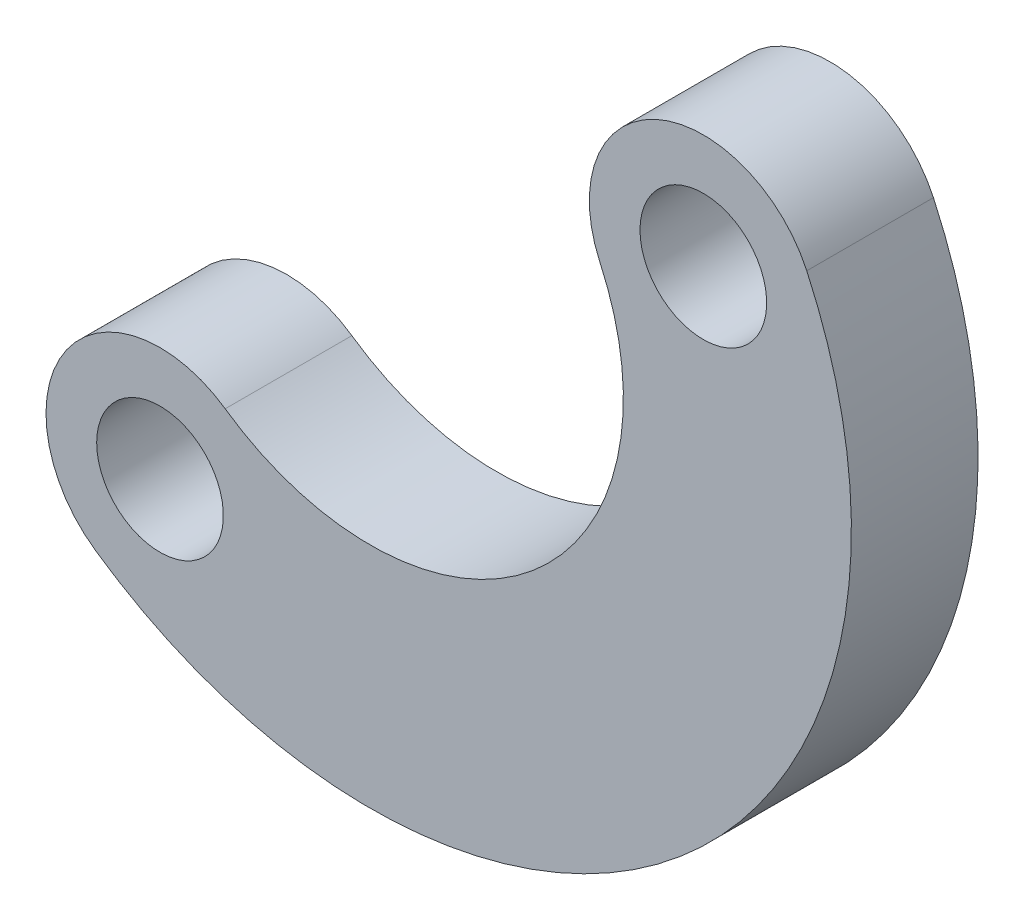
ISO-10303-21;
HEADER;
FILE_DESCRIPTION(('STEP AP214'),'2;1');
FILE_NAME('part.step','',(''),(''),'','','');
FILE_SCHEMA(('AUTOMOTIVE_DESIGN { 1 0 10303 214 1 1 1 1 }'));
ENDSEC;
DATA;
#1=APPLICATION_CONTEXT('core data for automotive mechanical design processes');
#2=APPLICATION_PROTOCOL_DEFINITION('international standard','automotive_design',2000,#1);
#3=PRODUCT_CONTEXT('',#1,'mechanical');
#4=PRODUCT('Part','Part','',(#3));
#5=PRODUCT_RELATED_PRODUCT_CATEGORY('part','',(#4));
#6=PRODUCT_DEFINITION_FORMATION('','',#4);
#7=PRODUCT_DEFINITION_CONTEXT('part definition',#1,'design');
#8=PRODUCT_DEFINITION('design','',#6,#7);
#9=PRODUCT_DEFINITION_SHAPE('','',#8);
#10=(LENGTH_UNIT() NAMED_UNIT(*) SI_UNIT(.MILLI.,.METRE.));
#11=(NAMED_UNIT(*) PLANE_ANGLE_UNIT() SI_UNIT($,.RADIAN.));
#12=(NAMED_UNIT(*) SI_UNIT($,.STERADIAN.) SOLID_ANGLE_UNIT());
#13=UNCERTAINTY_MEASURE_WITH_UNIT(LENGTH_MEASURE(1.E-05),#10,'distance_accuracy_value','');
#14=(GEOMETRIC_REPRESENTATION_CONTEXT(3) GLOBAL_UNCERTAINTY_ASSIGNED_CONTEXT((#13)) GLOBAL_UNIT_ASSIGNED_CONTEXT((#10,
#11,#12)) REPRESENTATION_CONTEXT('',''));
#15=CARTESIAN_POINT('',(0.,0.,0.));
#16=DIRECTION('',(0.,0.,1.));
#17=DIRECTION('',(1.,0.,0.));
#18=AXIS2_PLACEMENT_3D('',#15,#16,#17);
#19=CARTESIAN_POINT('',(-19.5131267924345,28.5690281099331,17.));
#20=DIRECTION('',(0.,0.,1.));
#21=DIRECTION('',(1.,0.,0.));
#22=AXIS2_PLACEMENT_3D('',#19,#20,#21);
#23=PLANE('',#22);
#24=CARTESIAN_POINT('',(-22.,25.,17.));
#25=DIRECTION('',(0.,0.,-1.));
#26=DIRECTION('',(1.,0.,0.));
#27=AXIS2_PLACEMENT_3D('',#24,#25,#26);
#28=CIRCLE('',#27,2.69999999999998);
#29=CARTESIAN_POINT('',(-23.5435764736614,22.784741173145,17.));
#30=VERTEX_POINT('',#29);
#31=CARTESIAN_POINT('',(-20.4564235263386,27.215258826855,17.));
#32=VERTEX_POINT('',#31);
#33=EDGE_CURVE('E87',#30,#32,#28,.T.);
#34=ORIENTED_EDGE('',*,*,#33,.T.);
#35=CARTESIAN_POINT('',(-17.0262535848689,32.1380562198662,17.));
#36=DIRECTION('',(0.,0.,1.));
#37=DIRECTION('',(1.,0.,0.));
#38=AXIS2_PLACEMENT_3D('',#35,#36,#37);
#39=CIRCLE('',#38,6.);
#40=CARTESIAN_POINT('',(-11.5826017862991,34.6612793760551,17.));
#41=VERTEX_POINT('',#40);
#42=EDGE_CURVE('E82',#32,#41,#39,.T.);
#43=ORIENTED_EDGE('',*,*,#42,.T.);
#44=CARTESIAN_POINT('',(-9.13295847694271,35.7967297963401,17.));
#45=DIRECTION('',(0.,0.,-1.));
#46=DIRECTION('',(1.,0.,0.));
#47=AXIS2_PLACEMENT_3D('',#44,#45,#46);
#48=CIRCLE('',#47,2.69999999999999);
#49=CARTESIAN_POINT('',(-6.6833151675863,36.9321802166251,17.));
#50=VERTEX_POINT('',#49);
#51=EDGE_CURVE('E85',#41,#50,#48,.T.);
#52=ORIENTED_EDGE('',*,*,#51,.T.);
#53=CARTESIAN_POINT('',(-17.0262535848689,32.1380562198662,17.));
#54=DIRECTION('',(0.,0.,-1.));
#55=DIRECTION('',(1.,0.,0.));
#56=AXIS2_PLACEMENT_3D('',#53,#54,#55);
#57=CIRCLE('',#56,11.4);
#58=EDGE_CURVE('E52',#50,#30,#57,.T.);
#59=ORIENTED_EDGE('',*,*,#58,.T.);
#60=EDGE_LOOP('',(#34,#43,#52,#59));
#61=FACE_BOUND('',#60,.T.);
#62=CARTESIAN_POINT('',(-9.13295847694271,35.7967297963401,17.));
#63=DIRECTION('',(0.,0.,-1.));
#64=DIRECTION('',(-1.,0.,0.));
#65=AXIS2_PLACEMENT_3D('',#62,#63,#64);
#66=CIRCLE('',#65,1.5);
#67=CARTESIAN_POINT('',(-10.6329584769427,35.7967297963401,17.));
#68=VERTEX_POINT('',#67);
#69=EDGE_CURVE('E102',#68,#68,#66,.T.);
#70=ORIENTED_EDGE('',*,*,#69,.F.);
#71=EDGE_LOOP('',(#70));
#72=FACE_BOUND('',#71,.T.);
#73=CARTESIAN_POINT('',(-22.,25.,17.));
#74=DIRECTION('',(0.,0.,-1.));
#75=DIRECTION('',(-1.,0.,0.));
#76=AXIS2_PLACEMENT_3D('',#73,#74,#75);
#77=CIRCLE('',#76,1.5);
#78=CARTESIAN_POINT('',(-23.5,25.,17.));
#79=VERTEX_POINT('',#78);
#80=EDGE_CURVE('E117',#79,#79,#77,.T.);
#81=ORIENTED_EDGE('',*,*,#80,.F.);
#82=EDGE_LOOP('',(#81));
#83=FACE_BOUND('',#82,.T.);
#84=ADVANCED_FACE('F35',(#61,#72,#83),#23,.F.);
#85=CARTESIAN_POINT('',(-19.5131267924345,28.5690281099331,20.));
#86=DIRECTION('',(0.,0.,1.));
#87=DIRECTION('',(1.,0.,0.));
#88=AXIS2_PLACEMENT_3D('',#85,#86,#87);
#89=PLANE('',#88);
#90=CARTESIAN_POINT('',(-9.13295847694271,35.7967297963401,20.));
#91=DIRECTION('',(0.,0.,-1.));
#92=DIRECTION('',(-1.,0.,0.));
#93=AXIS2_PLACEMENT_3D('',#90,#91,#92);
#94=CIRCLE('',#93,1.5);
#95=CARTESIAN_POINT('',(-10.6329584769427,35.7967297963401,20.));
#96=VERTEX_POINT('',#95);
#97=EDGE_CURVE('E114',#96,#96,#94,.T.);
#98=ORIENTED_EDGE('',*,*,#97,.T.);
#99=EDGE_LOOP('',(#98));
#100=FACE_BOUND('',#99,.T.);
#101=CARTESIAN_POINT('',(-22.,25.,20.));
#102=DIRECTION('',(0.,0.,-1.));
#103=DIRECTION('',(1.,0.,0.));
#104=AXIS2_PLACEMENT_3D('',#101,#102,#103);
#105=CIRCLE('',#104,2.69999999999998);
#106=CARTESIAN_POINT('',(-23.5435764736614,22.784741173145,20.));
#107=VERTEX_POINT('',#106);
#108=CARTESIAN_POINT('',(-20.4564235263386,27.215258826855,20.));
#109=VERTEX_POINT('',#108);
#110=EDGE_CURVE('E99',#107,#109,#105,.T.);
#111=ORIENTED_EDGE('',*,*,#110,.F.);
#112=CARTESIAN_POINT('',(-17.0262535848689,32.1380562198662,20.));
#113=DIRECTION('',(0.,0.,-1.));
#114=DIRECTION('',(1.,0.,0.));
#115=AXIS2_PLACEMENT_3D('',#112,#113,#114);
#116=CIRCLE('',#115,11.4);
#117=CARTESIAN_POINT('',(-6.6833151675863,36.9321802166251,20.));
#118=VERTEX_POINT('',#117);
#119=EDGE_CURVE('E75',#118,#107,#116,.T.);
#120=ORIENTED_EDGE('',*,*,#119,.F.);
#121=CARTESIAN_POINT('',(-9.13295847694271,35.7967297963401,20.));
#122=DIRECTION('',(0.,0.,-1.));
#123=DIRECTION('',(1.,0.,0.));
#124=AXIS2_PLACEMENT_3D('',#121,#122,#123);
#125=CIRCLE('',#124,2.69999999999999);
#126=CARTESIAN_POINT('',(-11.5826017862991,34.6612793760551,20.));
#127=VERTEX_POINT('',#126);
#128=EDGE_CURVE('E69',#127,#118,#125,.T.);
#129=ORIENTED_EDGE('',*,*,#128,.F.);
#130=CARTESIAN_POINT('',(-17.0262535848689,32.1380562198662,20.));
#131=DIRECTION('',(0.,0.,1.));
#132=DIRECTION('',(1.,0.,0.));
#133=AXIS2_PLACEMENT_3D('',#130,#131,#132);
#134=CIRCLE('',#133,6.);
#135=EDGE_CURVE('E91',#109,#127,#134,.T.);
#136=ORIENTED_EDGE('',*,*,#135,.F.);
#137=EDGE_LOOP('',(#111,#120,#129,#136));
#138=FACE_BOUND('',#137,.T.);
#139=CARTESIAN_POINT('',(-22.,25.,20.));
#140=DIRECTION('',(0.,0.,-1.));
#141=DIRECTION('',(-1.,0.,0.));
#142=AXIS2_PLACEMENT_3D('',#139,#140,#141);
#143=CIRCLE('',#142,1.5);
#144=CARTESIAN_POINT('',(-23.5,25.,20.));
#145=VERTEX_POINT('',#144);
#146=EDGE_CURVE('E120',#145,#145,#143,.T.);
#147=ORIENTED_EDGE('',*,*,#146,.T.);
#148=EDGE_LOOP('',(#147));
#149=FACE_BOUND('',#148,.T.);
#150=ADVANCED_FACE('F110',(#100,#138,#149),#89,.T.);
#151=CARTESIAN_POINT('',(-22.,25.,17.));
#152=DIRECTION('',(0.,0.,1.));
#153=DIRECTION('',(1.,0.,0.));
#154=AXIS2_PLACEMENT_3D('',#151,#152,#153);
#155=CYLINDRICAL_SURFACE('',#154,2.69999999999998);
#156=ORIENTED_EDGE('',*,*,#110,.T.);
#157=DIRECTION('',(0.,0.,1.));
#158=VECTOR('',#157,1.);
#159=CARTESIAN_POINT('',(-20.4564235263386,27.215258826855,17.));
#160=LINE('',#159,#158);
#161=EDGE_CURVE('E11',#32,#109,#160,.T.);
#162=ORIENTED_EDGE('',*,*,#161,.F.);
#163=ORIENTED_EDGE('',*,*,#33,.F.);
#164=DIRECTION('',(0.,0.,1.));
#165=VECTOR('',#164,1.);
#166=CARTESIAN_POINT('',(-23.5435764736614,22.784741173145,17.));
#167=LINE('',#166,#165);
#168=EDGE_CURVE('E95',#30,#107,#167,.T.);
#169=ORIENTED_EDGE('',*,*,#168,.T.);
#170=EDGE_LOOP('',(#156,#162,#163,#169));
#171=FACE_BOUND('',#170,.T.);
#172=ADVANCED_FACE('F37',(#171),#155,.T.);
#173=CARTESIAN_POINT('',(-17.0262535848689,32.1380562198662,17.));
#174=DIRECTION('',(0.,0.,1.));
#175=DIRECTION('',(1.,0.,0.));
#176=AXIS2_PLACEMENT_3D('',#173,#174,#175);
#177=CYLINDRICAL_SURFACE('',#176,6.);
#178=ORIENTED_EDGE('',*,*,#135,.T.);
#179=DIRECTION('',(0.,0.,1.));
#180=VECTOR('',#179,1.);
#181=CARTESIAN_POINT('',(-11.5826017862991,34.6612793760551,17.));
#182=LINE('',#181,#180);
#183=EDGE_CURVE('E44',#41,#127,#182,.T.);
#184=ORIENTED_EDGE('',*,*,#183,.F.);
#185=ORIENTED_EDGE('',*,*,#42,.F.);
#186=ORIENTED_EDGE('',*,*,#161,.T.);
#187=EDGE_LOOP('',(#178,#184,#185,#186));
#188=FACE_BOUND('',#187,.T.);
#189=ADVANCED_FACE('F90',(#188),#177,.F.);
#190=CARTESIAN_POINT('',(-9.13295847694271,35.7967297963401,17.));
#191=DIRECTION('',(0.,0.,1.));
#192=DIRECTION('',(1.,0.,0.));
#193=AXIS2_PLACEMENT_3D('',#190,#191,#192);
#194=CYLINDRICAL_SURFACE('',#193,2.69999999999999);
#195=ORIENTED_EDGE('',*,*,#128,.T.);
#196=DIRECTION('',(0.,0.,1.));
#197=VECTOR('',#196,1.);
#198=CARTESIAN_POINT('',(-6.6833151675863,36.9321802166251,17.));
#199=LINE('',#198,#197);
#200=EDGE_CURVE('E92',#50,#118,#199,.T.);
#201=ORIENTED_EDGE('',*,*,#200,.F.);
#202=ORIENTED_EDGE('',*,*,#51,.F.);
#203=ORIENTED_EDGE('',*,*,#183,.T.);
#204=EDGE_LOOP('',(#195,#201,#202,#203));
#205=FACE_BOUND('',#204,.T.);
#206=ADVANCED_FACE('F93',(#205),#194,.T.);
#207=CARTESIAN_POINT('',(-17.0262535848689,32.1380562198662,17.));
#208=DIRECTION('',(0.,0.,1.));
#209=DIRECTION('',(1.,0.,0.));
#210=AXIS2_PLACEMENT_3D('',#207,#208,#209);
#211=CYLINDRICAL_SURFACE('',#210,11.4);
#212=ORIENTED_EDGE('',*,*,#119,.T.);
#213=ORIENTED_EDGE('',*,*,#168,.F.);
#214=ORIENTED_EDGE('',*,*,#58,.F.);
#215=ORIENTED_EDGE('',*,*,#200,.T.);
#216=EDGE_LOOP('',(#212,#213,#214,#215));
#217=FACE_BOUND('',#216,.T.);
#218=ADVANCED_FACE('F107',(#217),#211,.T.);
#219=CARTESIAN_POINT('',(-9.13295847694271,35.7967297963401,17.));
#220=DIRECTION('',(0.,0.,1.));
#221=DIRECTION('',(1.,0.,0.));
#222=AXIS2_PLACEMENT_3D('',#219,#220,#221);
#223=CYLINDRICAL_SURFACE('',#222,1.5);
#224=ORIENTED_EDGE('',*,*,#69,.T.);
#225=EDGE_LOOP('',(#224));
#226=FACE_BOUND('',#225,.T.);
#227=ORIENTED_EDGE('',*,*,#97,.F.);
#228=EDGE_LOOP('',(#227));
#229=FACE_BOUND('',#228,.T.);
#230=ADVANCED_FACE('F137',(#226,#229),#223,.F.);
#231=CARTESIAN_POINT('',(-22.,25.,17.));
#232=DIRECTION('',(0.,0.,1.));
#233=DIRECTION('',(1.,0.,0.));
#234=AXIS2_PLACEMENT_3D('',#231,#232,#233);
#235=CYLINDRICAL_SURFACE('',#234,1.5);
#236=ORIENTED_EDGE('',*,*,#80,.T.);
#237=EDGE_LOOP('',(#236));
#238=FACE_BOUND('',#237,.T.);
#239=ORIENTED_EDGE('',*,*,#146,.F.);
#240=EDGE_LOOP('',(#239));
#241=FACE_BOUND('',#240,.T.);
#242=ADVANCED_FACE('F126',(#238,#241),#235,.F.);
#243=CLOSED_SHELL('',(#84,#150,#172,#189,#206,#218,#230,#242));
#244=MANIFOLD_SOLID_BREP('B2',#243);
#245=ADVANCED_BREP_SHAPE_REPRESENTATION('',(#18,#244),#14);
#246=SHAPE_DEFINITION_REPRESENTATION(#9,#245);
ENDSEC;
END-ISO-10303-21;
